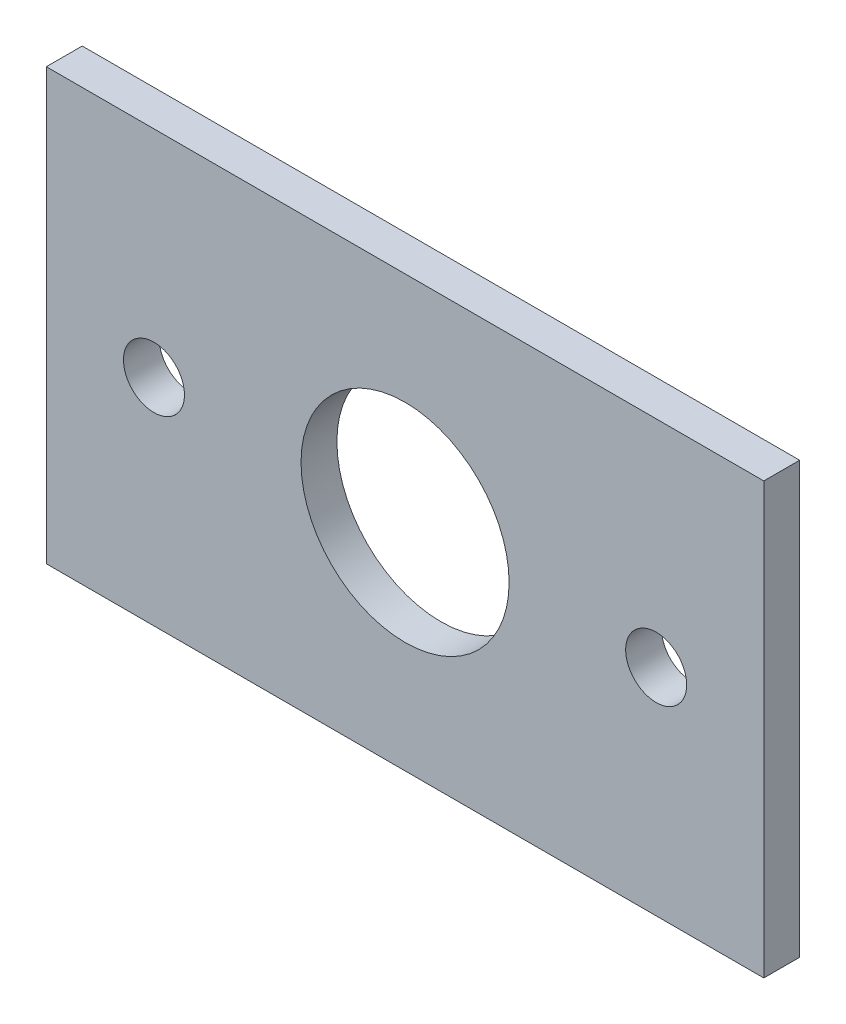
ISO-10303-21;
HEADER;
FILE_DESCRIPTION(('STEP AP214'),'2;1');
FILE_NAME('part.step','',(''),(''),'','','');
FILE_SCHEMA(('AUTOMOTIVE_DESIGN { 1 0 10303 214 1 1 1 1 }'));
ENDSEC;
DATA;
#1=APPLICATION_CONTEXT('core data for automotive mechanical design processes');
#2=APPLICATION_PROTOCOL_DEFINITION('international standard','automotive_design',2000,#1);
#3=PRODUCT_CONTEXT('',#1,'mechanical');
#4=PRODUCT('Part','Part','',(#3));
#5=PRODUCT_RELATED_PRODUCT_CATEGORY('part','',(#4));
#6=PRODUCT_DEFINITION_FORMATION('','',#4);
#7=PRODUCT_DEFINITION_CONTEXT('part definition',#1,'design');
#8=PRODUCT_DEFINITION('design','',#6,#7);
#9=PRODUCT_DEFINITION_SHAPE('','',#8);
#10=(LENGTH_UNIT() NAMED_UNIT(*) SI_UNIT(.MILLI.,.METRE.));
#11=(NAMED_UNIT(*) PLANE_ANGLE_UNIT() SI_UNIT($,.RADIAN.));
#12=(NAMED_UNIT(*) SI_UNIT($,.STERADIAN.) SOLID_ANGLE_UNIT());
#13=UNCERTAINTY_MEASURE_WITH_UNIT(LENGTH_MEASURE(1.E-05),#10,'distance_accuracy_value','');
#14=(GEOMETRIC_REPRESENTATION_CONTEXT(3) GLOBAL_UNCERTAINTY_ASSIGNED_CONTEXT((#13)) GLOBAL_UNIT_ASSIGNED_CONTEXT((#10,
#11,#12)) REPRESENTATION_CONTEXT('',''));
#15=CARTESIAN_POINT('',(0.,0.,0.));
#16=DIRECTION('',(0.,0.,1.));
#17=DIRECTION('',(1.,0.,0.));
#18=AXIS2_PLACEMENT_3D('',#15,#16,#17);
#19=CARTESIAN_POINT('',(0.,0.,2.));
#20=DIRECTION('',(0.,0.,-1.));
#21=DIRECTION('',(-1.,0.,0.));
#22=AXIS2_PLACEMENT_3D('',#19,#20,#21);
#23=PLANE('',#22);
#24=DIRECTION('',(0.,-1.,0.));
#25=VECTOR('',#24,1.);
#26=CARTESIAN_POINT('',(-20.,-12.,2.));
#27=LINE('',#26,#25);
#28=CARTESIAN_POINT('',(-20.,12.,2.));
#29=VERTEX_POINT('',#28);
#30=CARTESIAN_POINT('',(-20.,-12.,2.));
#31=VERTEX_POINT('',#30);
#32=EDGE_CURVE('E98',#29,#31,#27,.T.);
#33=ORIENTED_EDGE('',*,*,#32,.T.);
#34=DIRECTION('',(1.,0.,0.));
#35=VECTOR('',#34,1.);
#36=CARTESIAN_POINT('',(-20.,-12.,2.));
#37=LINE('',#36,#35);
#38=CARTESIAN_POINT('',(20.,-12.,2.));
#39=VERTEX_POINT('',#38);
#40=EDGE_CURVE('E91',#31,#39,#37,.T.);
#41=ORIENTED_EDGE('',*,*,#40,.T.);
#42=DIRECTION('',(0.,1.,0.));
#43=VECTOR('',#42,1.);
#44=CARTESIAN_POINT('',(20.,-12.,2.));
#45=LINE('',#44,#43);
#46=CARTESIAN_POINT('',(20.,12.,2.));
#47=VERTEX_POINT('',#46);
#48=EDGE_CURVE('E96',#39,#47,#45,.T.);
#49=ORIENTED_EDGE('',*,*,#48,.T.);
#50=DIRECTION('',(-1.,0.,0.));
#51=VECTOR('',#50,1.);
#52=CARTESIAN_POINT('',(-20.,12.,2.));
#53=LINE('',#52,#51);
#54=EDGE_CURVE('E62',#47,#29,#53,.T.);
#55=ORIENTED_EDGE('',*,*,#54,.T.);
#56=EDGE_LOOP('',(#33,#41,#49,#55));
#57=FACE_BOUND('',#56,.T.);
#58=CARTESIAN_POINT('',(0.,0.,2.));
#59=DIRECTION('',(0.,0.,1.));
#60=DIRECTION('',(1.,0.,0.));
#61=AXIS2_PLACEMENT_3D('',#58,#59,#60);
#62=CIRCLE('',#61,5.8);
#63=CARTESIAN_POINT('',(5.8,0.,2.));
#64=VERTEX_POINT('',#63);
#65=EDGE_CURVE('E116',#64,#64,#62,.T.);
#66=ORIENTED_EDGE('',*,*,#65,.F.);
#67=EDGE_LOOP('',(#66));
#68=FACE_BOUND('',#67,.T.);
#69=CARTESIAN_POINT('',(-14.,0.,2.));
#70=DIRECTION('',(0.,0.,1.));
#71=DIRECTION('',(1.,0.,0.));
#72=AXIS2_PLACEMENT_3D('',#69,#70,#71);
#73=CIRCLE('',#72,1.7);
#74=CARTESIAN_POINT('',(-12.3,0.,2.));
#75=VERTEX_POINT('',#74);
#76=EDGE_CURVE('E139',#75,#75,#73,.T.);
#77=ORIENTED_EDGE('',*,*,#76,.F.);
#78=EDGE_LOOP('',(#77));
#79=FACE_BOUND('',#78,.T.);
#80=CARTESIAN_POINT('',(14.,0.,2.));
#81=DIRECTION('',(0.,0.,1.));
#82=DIRECTION('',(1.,0.,0.));
#83=AXIS2_PLACEMENT_3D('',#80,#81,#82);
#84=CIRCLE('',#83,1.7);
#85=CARTESIAN_POINT('',(15.7,0.,2.));
#86=VERTEX_POINT('',#85);
#87=EDGE_CURVE('E146',#86,#86,#84,.T.);
#88=ORIENTED_EDGE('',*,*,#87,.F.);
#89=EDGE_LOOP('',(#88));
#90=FACE_BOUND('',#89,.T.);
#91=ADVANCED_FACE('F44',(#57,#68,#79,#90),#23,.F.);
#92=CARTESIAN_POINT('',(0.,0.,0.));
#93=DIRECTION('',(0.,0.,-1.));
#94=DIRECTION('',(-1.,0.,0.));
#95=AXIS2_PLACEMENT_3D('',#92,#93,#94);
#96=PLANE('',#95);
#97=CARTESIAN_POINT('',(-14.,0.,0.));
#98=DIRECTION('',(0.,0.,1.));
#99=DIRECTION('',(1.,0.,0.));
#100=AXIS2_PLACEMENT_3D('',#97,#98,#99);
#101=CIRCLE('',#100,1.7);
#102=CARTESIAN_POINT('',(-12.3,0.,0.));
#103=VERTEX_POINT('',#102);
#104=EDGE_CURVE('E145',#103,#103,#101,.T.);
#105=ORIENTED_EDGE('',*,*,#104,.T.);
#106=EDGE_LOOP('',(#105));
#107=FACE_BOUND('',#106,.T.);
#108=DIRECTION('',(0.,-1.,0.));
#109=VECTOR('',#108,1.);
#110=CARTESIAN_POINT('',(-20.,-12.,0.));
#111=LINE('',#110,#109);
#112=CARTESIAN_POINT('',(-20.,12.,0.));
#113=VERTEX_POINT('',#112);
#114=CARTESIAN_POINT('',(-20.,-12.,0.));
#115=VERTEX_POINT('',#114);
#116=EDGE_CURVE('E118',#113,#115,#111,.T.);
#117=ORIENTED_EDGE('',*,*,#116,.F.);
#118=DIRECTION('',(-1.,0.,0.));
#119=VECTOR('',#118,1.);
#120=CARTESIAN_POINT('',(-20.,12.,0.));
#121=LINE('',#120,#119);
#122=CARTESIAN_POINT('',(20.,12.,0.));
#123=VERTEX_POINT('',#122);
#124=EDGE_CURVE('E88',#123,#113,#121,.T.);
#125=ORIENTED_EDGE('',*,*,#124,.F.);
#126=DIRECTION('',(0.,1.,0.));
#127=VECTOR('',#126,1.);
#128=CARTESIAN_POINT('',(20.,-12.,0.));
#129=LINE('',#128,#127);
#130=CARTESIAN_POINT('',(20.,-12.,0.));
#131=VERTEX_POINT('',#130);
#132=EDGE_CURVE('E76',#131,#123,#129,.T.);
#133=ORIENTED_EDGE('',*,*,#132,.F.);
#134=DIRECTION('',(1.,0.,0.));
#135=VECTOR('',#134,1.);
#136=CARTESIAN_POINT('',(-20.,-12.,0.));
#137=LINE('',#136,#135);
#138=EDGE_CURVE('E103',#115,#131,#137,.T.);
#139=ORIENTED_EDGE('',*,*,#138,.F.);
#140=EDGE_LOOP('',(#117,#125,#133,#139));
#141=FACE_BOUND('',#140,.T.);
#142=CARTESIAN_POINT('',(0.,0.,0.));
#143=DIRECTION('',(0.,0.,1.));
#144=DIRECTION('',(1.,0.,0.));
#145=AXIS2_PLACEMENT_3D('',#142,#143,#144);
#146=CIRCLE('',#145,5.8);
#147=CARTESIAN_POINT('',(5.8,0.,0.));
#148=VERTEX_POINT('',#147);
#149=EDGE_CURVE('E136',#148,#148,#146,.T.);
#150=ORIENTED_EDGE('',*,*,#149,.T.);
#151=EDGE_LOOP('',(#150));
#152=FACE_BOUND('',#151,.T.);
#153=CARTESIAN_POINT('',(14.,0.,0.));
#154=DIRECTION('',(0.,0.,1.));
#155=DIRECTION('',(1.,0.,0.));
#156=AXIS2_PLACEMENT_3D('',#153,#154,#155);
#157=CIRCLE('',#156,1.7);
#158=CARTESIAN_POINT('',(15.7,0.,0.));
#159=VERTEX_POINT('',#158);
#160=EDGE_CURVE('E155',#159,#159,#157,.T.);
#161=ORIENTED_EDGE('',*,*,#160,.T.);
#162=EDGE_LOOP('',(#161));
#163=FACE_BOUND('',#162,.T.);
#164=ADVANCED_FACE('F134',(#107,#141,#152,#163),#96,.T.);
#165=CARTESIAN_POINT('',(-20.,-12.,2.));
#166=DIRECTION('',(1.,0.,0.));
#167=DIRECTION('',(0.,0.,-1.));
#168=AXIS2_PLACEMENT_3D('',#165,#166,#167);
#169=PLANE('',#168);
#170=ORIENTED_EDGE('',*,*,#116,.T.);
#171=DIRECTION('',(0.,0.,-1.));
#172=VECTOR('',#171,1.);
#173=CARTESIAN_POINT('',(-20.,-12.,2.));
#174=LINE('',#173,#172);
#175=EDGE_CURVE('E11',#31,#115,#174,.T.);
#176=ORIENTED_EDGE('',*,*,#175,.F.);
#177=ORIENTED_EDGE('',*,*,#32,.F.);
#178=DIRECTION('',(0.,0.,-1.));
#179=VECTOR('',#178,1.);
#180=CARTESIAN_POINT('',(-20.,12.,2.));
#181=LINE('',#180,#179);
#182=EDGE_CURVE('E115',#29,#113,#181,.T.);
#183=ORIENTED_EDGE('',*,*,#182,.T.);
#184=EDGE_LOOP('',(#170,#176,#177,#183));
#185=FACE_BOUND('',#184,.T.);
#186=ADVANCED_FACE('F50',(#185),#169,.F.);
#187=CARTESIAN_POINT('',(-20.,-12.,2.));
#188=DIRECTION('',(0.,1.,0.));
#189=DIRECTION('',(0.,0.,1.));
#190=AXIS2_PLACEMENT_3D('',#187,#188,#189);
#191=PLANE('',#190);
#192=ORIENTED_EDGE('',*,*,#138,.T.);
#193=DIRECTION('',(0.,0.,-1.));
#194=VECTOR('',#193,1.);
#195=CARTESIAN_POINT('',(20.,-12.,2.));
#196=LINE('',#195,#194);
#197=EDGE_CURVE('E54',#39,#131,#196,.T.);
#198=ORIENTED_EDGE('',*,*,#197,.F.);
#199=ORIENTED_EDGE('',*,*,#40,.F.);
#200=ORIENTED_EDGE('',*,*,#175,.T.);
#201=EDGE_LOOP('',(#192,#198,#199,#200));
#202=FACE_BOUND('',#201,.T.);
#203=ADVANCED_FACE('F105',(#202),#191,.F.);
#204=CARTESIAN_POINT('',(20.,-12.,2.));
#205=DIRECTION('',(-1.,0.,0.));
#206=DIRECTION('',(0.,0.,1.));
#207=AXIS2_PLACEMENT_3D('',#204,#205,#206);
#208=PLANE('',#207);
#209=ORIENTED_EDGE('',*,*,#132,.T.);
#210=DIRECTION('',(0.,0.,-1.));
#211=VECTOR('',#210,1.);
#212=CARTESIAN_POINT('',(20.,12.,2.));
#213=LINE('',#212,#211);
#214=EDGE_CURVE('E104',#47,#123,#213,.T.);
#215=ORIENTED_EDGE('',*,*,#214,.F.);
#216=ORIENTED_EDGE('',*,*,#48,.F.);
#217=ORIENTED_EDGE('',*,*,#197,.T.);
#218=EDGE_LOOP('',(#209,#215,#216,#217));
#219=FACE_BOUND('',#218,.T.);
#220=ADVANCED_FACE('F106',(#219),#208,.F.);
#221=CARTESIAN_POINT('',(-20.,12.,2.));
#222=DIRECTION('',(0.,-1.,0.));
#223=DIRECTION('',(0.,0.,-1.));
#224=AXIS2_PLACEMENT_3D('',#221,#222,#223);
#225=PLANE('',#224);
#226=ORIENTED_EDGE('',*,*,#124,.T.);
#227=ORIENTED_EDGE('',*,*,#182,.F.);
#228=ORIENTED_EDGE('',*,*,#54,.F.);
#229=ORIENTED_EDGE('',*,*,#214,.T.);
#230=EDGE_LOOP('',(#226,#227,#228,#229));
#231=FACE_BOUND('',#230,.T.);
#232=ADVANCED_FACE('F129',(#231),#225,.F.);
#233=CARTESIAN_POINT('',(0.,0.,2.));
#234=DIRECTION('',(0.,0.,-1.));
#235=DIRECTION('',(-1.,0.,0.));
#236=AXIS2_PLACEMENT_3D('',#233,#234,#235);
#237=CYLINDRICAL_SURFACE('',#236,5.8);
#238=ORIENTED_EDGE('',*,*,#65,.T.);
#239=EDGE_LOOP('',(#238));
#240=FACE_BOUND('',#239,.T.);
#241=ORIENTED_EDGE('',*,*,#149,.F.);
#242=EDGE_LOOP('',(#241));
#243=FACE_BOUND('',#242,.T.);
#244=ADVANCED_FACE('F168',(#240,#243),#237,.F.);
#245=CARTESIAN_POINT('',(-14.,0.,2.));
#246=DIRECTION('',(0.,0.,-1.));
#247=DIRECTION('',(-1.,0.,0.));
#248=AXIS2_PLACEMENT_3D('',#245,#246,#247);
#249=CYLINDRICAL_SURFACE('',#248,1.7);
#250=ORIENTED_EDGE('',*,*,#76,.T.);
#251=EDGE_LOOP('',(#250));
#252=FACE_BOUND('',#251,.T.);
#253=ORIENTED_EDGE('',*,*,#104,.F.);
#254=EDGE_LOOP('',(#253));
#255=FACE_BOUND('',#254,.T.);
#256=ADVANCED_FACE('F222',(#252,#255),#249,.F.);
#257=CARTESIAN_POINT('',(14.,0.,2.));
#258=DIRECTION('',(0.,0.,-1.));
#259=DIRECTION('',(-1.,0.,0.));
#260=AXIS2_PLACEMENT_3D('',#257,#258,#259);
#261=CYLINDRICAL_SURFACE('',#260,1.7);
#262=ORIENTED_EDGE('',*,*,#87,.T.);
#263=EDGE_LOOP('',(#262));
#264=FACE_BOUND('',#263,.T.);
#265=ORIENTED_EDGE('',*,*,#160,.F.);
#266=EDGE_LOOP('',(#265));
#267=FACE_BOUND('',#266,.T.);
#268=ADVANCED_FACE('F159',(#264,#267),#261,.F.);
#269=CLOSED_SHELL('',(#91,#164,#186,#203,#220,#232,#244,#256,#268));
#270=MANIFOLD_SOLID_BREP('B2',#269);
#271=ADVANCED_BREP_SHAPE_REPRESENTATION('',(#18,#270),#14);
#272=SHAPE_DEFINITION_REPRESENTATION(#9,#271);
ENDSEC;
END-ISO-10303-21;
